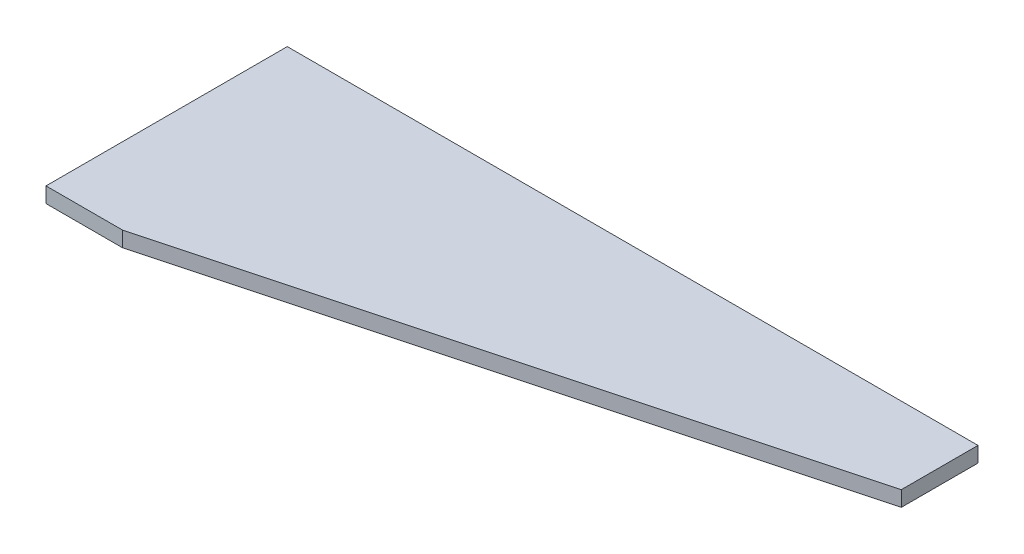
ISO-10303-21;
HEADER;
FILE_DESCRIPTION(('STEP AP214'),'2;1');
FILE_NAME('part.step','',(''),(''),'','','');
FILE_SCHEMA(('AUTOMOTIVE_DESIGN { 1 0 10303 214 1 1 1 1 }'));
ENDSEC;
DATA;
#1=APPLICATION_CONTEXT('core data for automotive mechanical design processes');
#2=APPLICATION_PROTOCOL_DEFINITION('international standard','automotive_design',2000,#1);
#3=PRODUCT_CONTEXT('',#1,'mechanical');
#4=PRODUCT('Part','Part','',(#3));
#5=PRODUCT_RELATED_PRODUCT_CATEGORY('part','',(#4));
#6=PRODUCT_DEFINITION_FORMATION('','',#4);
#7=PRODUCT_DEFINITION_CONTEXT('part definition',#1,'design');
#8=PRODUCT_DEFINITION('design','',#6,#7);
#9=PRODUCT_DEFINITION_SHAPE('','',#8);
#10=(LENGTH_UNIT() NAMED_UNIT(*) SI_UNIT(.MILLI.,.METRE.));
#11=(NAMED_UNIT(*) PLANE_ANGLE_UNIT() SI_UNIT($,.RADIAN.));
#12=(NAMED_UNIT(*) SI_UNIT($,.STERADIAN.) SOLID_ANGLE_UNIT());
#13=UNCERTAINTY_MEASURE_WITH_UNIT(LENGTH_MEASURE(1.E-05),#10,'distance_accuracy_value','');
#14=(GEOMETRIC_REPRESENTATION_CONTEXT(3) GLOBAL_UNCERTAINTY_ASSIGNED_CONTEXT((#13)) GLOBAL_UNIT_ASSIGNED_CONTEXT((#10,
#11,#12)) REPRESENTATION_CONTEXT('',''));
#15=CARTESIAN_POINT('',(0.,0.,0.));
#16=DIRECTION('',(0.,0.,1.));
#17=DIRECTION('',(1.,0.,0.));
#18=AXIS2_PLACEMENT_3D('',#15,#16,#17);
#19=CARTESIAN_POINT('',(60.,2.5,9.99999999999999));
#20=DIRECTION('',(0.,0.,1.));
#21=DIRECTION('',(1.,0.,0.));
#22=AXIS2_PLACEMENT_3D('',#19,#20,#21);
#23=PLANE('',#22);
#24=DIRECTION('',(-1.,0.,0.));
#25=VECTOR('',#24,1.);
#26=CARTESIAN_POINT('',(60.,-2.5,9.99999999999999));
#27=LINE('',#26,#25);
#28=CARTESIAN_POINT('',(285.,-2.5,10.));
#29=VERTEX_POINT('',#28);
#30=CARTESIAN_POINT('',(60.,-2.5,9.99999999999999));
#31=VERTEX_POINT('',#30);
#32=EDGE_CURVE('E110',#29,#31,#27,.T.);
#33=ORIENTED_EDGE('',*,*,#32,.T.);
#34=DIRECTION('',(0.,-1.,0.));
#35=VECTOR('',#34,1.);
#36=CARTESIAN_POINT('',(60.,2.5,9.99999999999999));
#37=LINE('',#36,#35);
#38=CARTESIAN_POINT('',(60.,2.5,9.99999999999999));
#39=VERTEX_POINT('',#38);
#40=EDGE_CURVE('E11',#39,#31,#37,.T.);
#41=ORIENTED_EDGE('',*,*,#40,.F.);
#42=DIRECTION('',(-1.,0.,0.));
#43=VECTOR('',#42,1.);
#44=CARTESIAN_POINT('',(60.,2.5,9.99999999999999));
#45=LINE('',#44,#43);
#46=CARTESIAN_POINT('',(285.,2.5,10.));
#47=VERTEX_POINT('',#46);
#48=EDGE_CURVE('E118',#47,#39,#45,.T.);
#49=ORIENTED_EDGE('',*,*,#48,.F.);
#50=DIRECTION('',(0.,-1.,0.));
#51=VECTOR('',#50,1.);
#52=CARTESIAN_POINT('',(285.,2.5,10.));
#53=LINE('',#52,#51);
#54=EDGE_CURVE('E106',#47,#29,#53,.T.);
#55=ORIENTED_EDGE('',*,*,#54,.T.);
#56=EDGE_LOOP('',(#33,#41,#49,#55));
#57=FACE_BOUND('',#56,.T.);
#58=ADVANCED_FACE('F36',(#57),#23,.F.);
#59=CARTESIAN_POINT('',(85.,2.5,88.589838486223));
#60=DIRECTION('',(0.,0.,-1.));
#61=DIRECTION('',(-1.,0.,0.));
#62=AXIS2_PLACEMENT_3D('',#59,#60,#61);
#63=PLANE('',#62);
#64=DIRECTION('',(1.,0.,0.));
#65=VECTOR('',#64,1.);
#66=CARTESIAN_POINT('',(85.,-2.5,88.589838486223));
#67=LINE('',#66,#65);
#68=CARTESIAN_POINT('',(60.,-2.5,88.589838486223));
#69=VERTEX_POINT('',#68);
#70=CARTESIAN_POINT('',(85.,-2.5,88.589838486223));
#71=VERTEX_POINT('',#70);
#72=EDGE_CURVE('E101',#69,#71,#67,.T.);
#73=ORIENTED_EDGE('',*,*,#72,.T.);
#74=DIRECTION('',(0.,-1.,0.));
#75=VECTOR('',#74,1.);
#76=CARTESIAN_POINT('',(85.,2.5,88.589838486223));
#77=LINE('',#76,#75);
#78=CARTESIAN_POINT('',(85.,2.5,88.589838486223));
#79=VERTEX_POINT('',#78);
#80=EDGE_CURVE('E98',#79,#71,#77,.T.);
#81=ORIENTED_EDGE('',*,*,#80,.F.);
#82=DIRECTION('',(1.,0.,0.));
#83=VECTOR('',#82,1.);
#84=CARTESIAN_POINT('',(85.,2.5,88.589838486223));
#85=LINE('',#84,#83);
#86=CARTESIAN_POINT('',(60.,2.5,88.589838486223));
#87=VERTEX_POINT('',#86);
#88=EDGE_CURVE('E90',#87,#79,#85,.T.);
#89=ORIENTED_EDGE('',*,*,#88,.F.);
#90=DIRECTION('',(0.,-1.,0.));
#91=VECTOR('',#90,1.);
#92=CARTESIAN_POINT('',(60.,2.5,88.589838486223));
#93=LINE('',#92,#91);
#94=EDGE_CURVE('E44',#87,#69,#93,.T.);
#95=ORIENTED_EDGE('',*,*,#94,.T.);
#96=EDGE_LOOP('',(#73,#81,#89,#95));
#97=FACE_BOUND('',#96,.T.);
#98=ADVANCED_FACE('F99',(#97),#63,.F.);
#99=CARTESIAN_POINT('',(285.,2.5,35.));
#100=DIRECTION('',(-0.258819045102514,0.,-0.96592582628907));
#101=DIRECTION('',(-0.96592582628907,0.,0.258819045102514));
#102=AXIS2_PLACEMENT_3D('',#99,#100,#101);
#103=PLANE('',#102);
#104=DIRECTION('',(0.96592582628907,0.,-0.258819045102514));
#105=VECTOR('',#104,1.);
#106=CARTESIAN_POINT('',(285.,-2.5,35.));
#107=LINE('',#106,#105);
#108=CARTESIAN_POINT('',(285.,-2.5,35.));
#109=VERTEX_POINT('',#108);
#110=EDGE_CURVE('E72',#71,#109,#107,.T.);
#111=ORIENTED_EDGE('',*,*,#110,.T.);
#112=DIRECTION('',(0.,-1.,0.));
#113=VECTOR('',#112,1.);
#114=CARTESIAN_POINT('',(285.,2.5,35.));
#115=LINE('',#114,#113);
#116=CARTESIAN_POINT('',(285.,2.5,35.));
#117=VERTEX_POINT('',#116);
#118=EDGE_CURVE('E102',#117,#109,#115,.T.);
#119=ORIENTED_EDGE('',*,*,#118,.F.);
#120=DIRECTION('',(0.96592582628907,0.,-0.258819045102514));
#121=VECTOR('',#120,1.);
#122=CARTESIAN_POINT('',(285.,2.5,35.));
#123=LINE('',#122,#121);
#124=EDGE_CURVE('E94',#79,#117,#123,.T.);
#125=ORIENTED_EDGE('',*,*,#124,.F.);
#126=ORIENTED_EDGE('',*,*,#80,.T.);
#127=EDGE_LOOP('',(#111,#119,#125,#126));
#128=FACE_BOUND('',#127,.T.);
#129=ADVANCED_FACE('F104',(#128),#103,.F.);
#130=CARTESIAN_POINT('',(285.,2.5,10.));
#131=DIRECTION('',(-1.,0.,0.));
#132=DIRECTION('',(0.,0.,1.));
#133=AXIS2_PLACEMENT_3D('',#130,#131,#132);
#134=PLANE('',#133);
#135=DIRECTION('',(0.,0.,-1.));
#136=VECTOR('',#135,1.);
#137=CARTESIAN_POINT('',(285.,-2.5,10.));
#138=LINE('',#137,#136);
#139=EDGE_CURVE('E78',#109,#29,#138,.T.);
#140=ORIENTED_EDGE('',*,*,#139,.T.);
#141=ORIENTED_EDGE('',*,*,#54,.F.);
#142=DIRECTION('',(0.,0.,-1.));
#143=VECTOR('',#142,1.);
#144=CARTESIAN_POINT('',(285.,2.5,10.));
#145=LINE('',#144,#143);
#146=EDGE_CURVE('E52',#117,#47,#145,.T.);
#147=ORIENTED_EDGE('',*,*,#146,.F.);
#148=ORIENTED_EDGE('',*,*,#118,.T.);
#149=EDGE_LOOP('',(#140,#141,#147,#148));
#150=FACE_BOUND('',#149,.T.);
#151=ADVANCED_FACE('F126',(#150),#134,.F.);
#152=CARTESIAN_POINT('',(0.,2.5,0.));
#153=DIRECTION('',(0.,-1.,0.));
#154=DIRECTION('',(0.,0.,-1.));
#155=AXIS2_PLACEMENT_3D('',#152,#153,#154);
#156=PLANE('',#155);
#157=ORIENTED_EDGE('',*,*,#48,.T.);
#158=DIRECTION('',(0.,0.,1.));
#159=VECTOR('',#158,1.);
#160=CARTESIAN_POINT('',(60.,2.5,88.589838486223));
#161=LINE('',#160,#159);
#162=EDGE_CURVE('E86',#39,#87,#161,.T.);
#163=ORIENTED_EDGE('',*,*,#162,.T.);
#164=ORIENTED_EDGE('',*,*,#88,.T.);
#165=ORIENTED_EDGE('',*,*,#124,.T.);
#166=ORIENTED_EDGE('',*,*,#146,.T.);
#167=EDGE_LOOP('',(#157,#163,#164,#165,#166));
#168=FACE_BOUND('',#167,.T.);
#169=ADVANCED_FACE('F92',(#168),#156,.F.);
#170=CARTESIAN_POINT('',(0.,-2.5,0.));
#171=DIRECTION('',(0.,-1.,0.));
#172=DIRECTION('',(0.,0.,-1.));
#173=AXIS2_PLACEMENT_3D('',#170,#171,#172);
#174=PLANE('',#173);
#175=ORIENTED_EDGE('',*,*,#32,.F.);
#176=ORIENTED_EDGE('',*,*,#139,.F.);
#177=ORIENTED_EDGE('',*,*,#110,.F.);
#178=ORIENTED_EDGE('',*,*,#72,.F.);
#179=DIRECTION('',(0.,0.,1.));
#180=VECTOR('',#179,1.);
#181=CARTESIAN_POINT('',(60.,-2.5,88.589838486223));
#182=LINE('',#181,#180);
#183=EDGE_CURVE('E113',#31,#69,#182,.T.);
#184=ORIENTED_EDGE('',*,*,#183,.F.);
#185=EDGE_LOOP('',(#175,#176,#177,#178,#184));
#186=FACE_BOUND('',#185,.T.);
#187=ADVANCED_FACE('F122',(#186),#174,.T.);
#188=CARTESIAN_POINT('',(60.,2.5,88.589838486223));
#189=DIRECTION('',(1.,0.,0.));
#190=DIRECTION('',(0.,0.,-1.));
#191=AXIS2_PLACEMENT_3D('',#188,#189,#190);
#192=PLANE('',#191);
#193=ORIENTED_EDGE('',*,*,#183,.T.);
#194=ORIENTED_EDGE('',*,*,#94,.F.);
#195=ORIENTED_EDGE('',*,*,#162,.F.);
#196=ORIENTED_EDGE('',*,*,#40,.T.);
#197=EDGE_LOOP('',(#193,#194,#195,#196));
#198=FACE_BOUND('',#197,.T.);
#199=ADVANCED_FACE('F138',(#198),#192,.F.);
#200=CLOSED_SHELL('',(#58,#98,#129,#151,#169,#187,#199));
#201=MANIFOLD_SOLID_BREP('B2',#200);
#202=ADVANCED_BREP_SHAPE_REPRESENTATION('',(#18,#201),#14);
#203=SHAPE_DEFINITION_REPRESENTATION(#9,#202);
ENDSEC;
END-ISO-10303-21;
